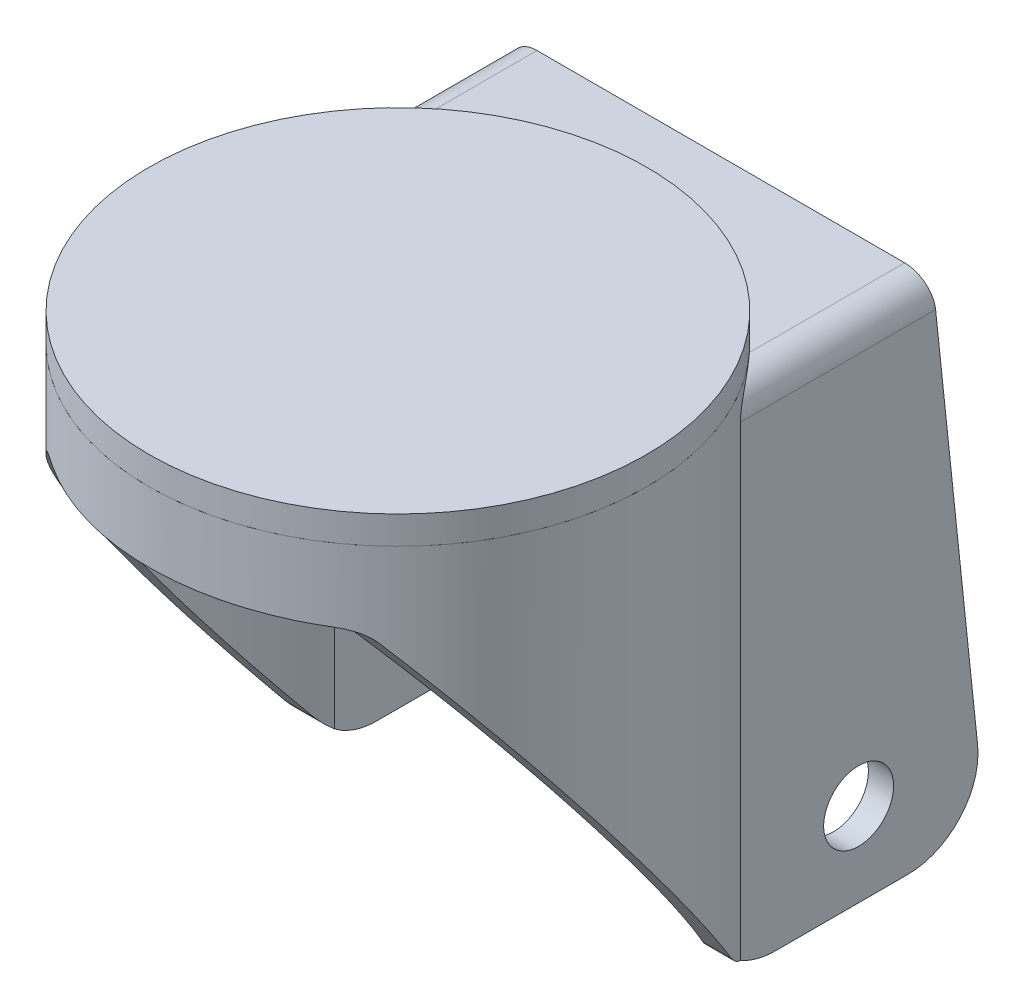
ISO-10303-21;
HEADER;
FILE_DESCRIPTION(('STEP AP214'),'2;1');
FILE_NAME('part.step','',(''),(''),'','','');
FILE_SCHEMA(('AUTOMOTIVE_DESIGN { 1 0 10303 214 1 1 1 1 }'));
ENDSEC;
DATA;
#1=APPLICATION_CONTEXT('core data for automotive mechanical design processes');
#2=APPLICATION_PROTOCOL_DEFINITION('international standard','automotive_design',2000,#1);
#3=PRODUCT_CONTEXT('',#1,'mechanical');
#4=PRODUCT('Part','Part','',(#3));
#5=PRODUCT_RELATED_PRODUCT_CATEGORY('part','',(#4));
#6=PRODUCT_DEFINITION_FORMATION('','',#4);
#7=PRODUCT_DEFINITION_CONTEXT('part definition',#1,'design');
#8=PRODUCT_DEFINITION('design','',#6,#7);
#9=PRODUCT_DEFINITION_SHAPE('','',#8);
#10=(LENGTH_UNIT() NAMED_UNIT(*) SI_UNIT(.MILLI.,.METRE.));
#11=(NAMED_UNIT(*) PLANE_ANGLE_UNIT() SI_UNIT($,.RADIAN.));
#12=(NAMED_UNIT(*) SI_UNIT($,.STERADIAN.) SOLID_ANGLE_UNIT());
#13=UNCERTAINTY_MEASURE_WITH_UNIT(LENGTH_MEASURE(1.E-05),#10,'distance_accuracy_value','');
#14=(GEOMETRIC_REPRESENTATION_CONTEXT(3) GLOBAL_UNCERTAINTY_ASSIGNED_CONTEXT((#13)) GLOBAL_UNIT_ASSIGNED_CONTEXT((#10,
#11,#12)) REPRESENTATION_CONTEXT('',''));
#15=CARTESIAN_POINT('',(0.,0.,0.));
#16=DIRECTION('',(0.,0.,1.));
#17=DIRECTION('',(1.,0.,0.));
#18=AXIS2_PLACEMENT_3D('',#15,#16,#17);
#19=CARTESIAN_POINT('',(0.,-38.,0.));
#20=DIRECTION('',(0.,-1.,0.));
#21=DIRECTION('',(0.,0.,-1.));
#22=AXIS2_PLACEMENT_3D('',#19,#20,#21);
#23=PLANE('',#22);
#24=DIRECTION('',(0.,0.,-1.));
#25=VECTOR('',#24,1.);
#26=CARTESIAN_POINT('',(15.15,-38.,0.));
#27=LINE('',#26,#25);
#28=CARTESIAN_POINT('',(15.15,-38.,-11.8372913800066));
#29=VERTEX_POINT('',#28);
#30=CARTESIAN_POINT('',(15.15,-38.,-21.3444444444444));
#31=VERTEX_POINT('',#30);
#32=EDGE_CURVE('E406',#29,#31,#27,.T.);
#33=ORIENTED_EDGE('',*,*,#32,.F.);
#34=DIRECTION('',(1.,0.,0.));
#35=VECTOR('',#34,1.);
#36=CARTESIAN_POINT('',(13.35,-38.,-11.8372913800066));
#37=LINE('',#36,#35);
#38=CARTESIAN_POINT('',(13.35,-38.,-11.8372913800066));
#39=VERTEX_POINT('',#38);
#40=EDGE_CURVE('E465',#29,#39,#37,.F.);
#41=ORIENTED_EDGE('',*,*,#40,.T.);
#42=DIRECTION('',(0.,0.,1.));
#43=VECTOR('',#42,1.);
#44=CARTESIAN_POINT('',(13.35,-38.,0.));
#45=LINE('',#44,#43);
#46=CARTESIAN_POINT('',(13.35,-38.,-21.3444444444444));
#47=VERTEX_POINT('',#46);
#48=EDGE_CURVE('E390',#47,#39,#45,.T.);
#49=ORIENTED_EDGE('',*,*,#48,.F.);
#50=DIRECTION('',(1.,0.,0.));
#51=VECTOR('',#50,1.);
#52=CARTESIAN_POINT('',(0.,-38.,-21.3444444444444));
#53=LINE('',#52,#51);
#54=EDGE_CURVE('E448',#47,#31,#53,.T.);
#55=ORIENTED_EDGE('',*,*,#54,.T.);
#56=EDGE_LOOP('',(#33,#41,#49,#55));
#57=FACE_BOUND('',#56,.T.);
#58=ADVANCED_FACE('F48',(#57),#23,.T.);
#59=CARTESIAN_POINT('',(0.,-38.,0.));
#60=DIRECTION('',(0.,1.,0.));
#61=DIRECTION('',(0.,0.,1.));
#62=AXIS2_PLACEMENT_3D('',#59,#60,#61);
#63=CYLINDRICAL_SURFACE('',#62,17.8);
#64=CARTESIAN_POINT('',(0.,-25.5995844777628,0.));
#65=DIRECTION('',(0.,0.60181502315205,-0.798635510047292));
#66=DIRECTION('',(0.,0.798635510047292,0.60181502315205));
#67=AXIS2_PLACEMENT_3D('',#64,#65,#66);
#68=ELLIPSE('',#67,29.5771945119801,17.8);
#69=CARTESIAN_POINT('',(11.8749417911061,-8.0030623430172,13.259930522361));
#70=VERTEX_POINT('',#69);
#71=CARTESIAN_POINT('',(15.9784191403783,-36.0090751157602,-7.84411382977014));
#72=VERTEX_POINT('',#71);
#73=EDGE_CURVE('E380',#70,#72,#68,.T.);
#74=ORIENTED_EDGE('',*,*,#73,.T.);
#75=CARTESIAN_POINT('',(15.9784191403783,-36.0090751157602,-7.84411382977015));
#76=CARTESIAN_POINT('',(15.9370643285474,-36.1209263768621,-7.92836646893781));
#77=CARTESIAN_POINT('',(15.8928061221344,-36.2284980160103,-8.01682426117746));
#78=CARTESIAN_POINT('',(15.7985679836179,-36.4345557424555,-8.20096866466969));
#79=CARTESIAN_POINT('',(15.7485884831887,-36.5330425141989,-8.2966547303605));
#80=CARTESIAN_POINT('',(15.6438829485341,-36.7188306796397,-8.49241137076984));
#81=CARTESIAN_POINT('',(15.5892518997026,-36.8062935799278,-8.59237993299204));
#82=CARTESIAN_POINT('',(15.4747009718694,-36.9716452851065,-8.79700855586593));
#83=CARTESIAN_POINT('',(15.4147835689916,-37.0495385319381,-8.90166640887018));
#84=CARTESIAN_POINT('',(15.3200249880923,-37.160369308893,-9.06316256439766));
#85=CARTESIAN_POINT('',(15.2870439362268,-37.1968544701722,-9.11869213710637));
#86=CARTESIAN_POINT('',(15.2195987988801,-37.2674037675836,-9.23082418364883));
#87=CARTESIAN_POINT('',(15.1851287234307,-37.3014563069182,-9.28743035341463));
#88=CARTESIAN_POINT('',(15.15,-37.3342138275323,-9.3443833397394));
#89=B_SPLINE_CURVE_WITH_KNOTS('',3,(#75,#76,#77,#78,#79,#80,#81,#82,#83,#84,#85,#86,#87,#88),
.UNSPECIFIED.,.F.,.F.,(4,2,2,2,2,2,4),(0.,0.437844269784068,0.8756555257534,1.30603416387316,
1.73621227249518,1.95869474531471,2.1821754237998),.UNSPECIFIED.);
#90=CARTESIAN_POINT('',(15.15,-37.3342138275322,-9.34438333973945));
#91=VERTEX_POINT('',#90);
#92=EDGE_CURVE('E328',#72,#91,#89,.T.);
#93=ORIENTED_EDGE('',*,*,#92,.T.);
#94=DIRECTION('',(0.,1.,0.));
#95=VECTOR('',#94,1.);
#96=CARTESIAN_POINT('',(15.15,-38.,-9.34438333973945));
#97=LINE('',#96,#95);
#98=CARTESIAN_POINT('',(15.15,-4.,-9.34438333973945));
#99=VERTEX_POINT('',#98);
#100=EDGE_CURVE('E367',#91,#99,#97,.T.);
#101=ORIENTED_EDGE('',*,*,#100,.T.);
#102=CARTESIAN_POINT('',(15.15,-4.,-9.34438333973945));
#103=CARTESIAN_POINT('',(15.1500044913851,-3.96802003997275,-9.34437491508055));
#104=CARTESIAN_POINT('',(15.1492324599647,-3.93605743037064,-9.34562783917578));
#105=CARTESIAN_POINT('',(15.1461802338515,-3.87242908389206,-9.35057417411396));
#106=CARTESIAN_POINT('',(15.1439017241506,-3.84076305537626,-9.35426485832448));
#107=CARTESIAN_POINT('',(15.1349412718755,-3.74722846589952,-9.36876114165658));
#108=CARTESIAN_POINT('',(15.1261320623997,-3.68606724013996,-9.38299518048252));
#109=CARTESIAN_POINT('',(15.1006925489816,-3.55216723035157,-9.42389442857311));
#110=CARTESIAN_POINT('',(15.0826502531463,-3.48039771070193,-9.45278914575787));
#111=CARTESIAN_POINT('',(15.040402650042,-3.3430536286514,-9.51986706916303));
#112=CARTESIAN_POINT('',(15.0161681189278,-3.27751052122967,-9.55809428027507));
#113=CARTESIAN_POINT('',(14.9479004189922,-3.11746567064031,-9.66468734081145));
#114=CARTESIAN_POINT('',(14.9004400209228,-3.0276597636102,-9.73783934105056));
#115=CARTESIAN_POINT('',(14.7975369191279,-2.8619486173237,-9.89351736127712));
#116=CARTESIAN_POINT('',(14.7420766683606,-2.78607479097534,-9.97606390119344));
#117=CARTESIAN_POINT('',(14.6339177774277,-2.65688528124339,-10.1339133284594));
#118=CARTESIAN_POINT('',(14.5820567984909,-2.60189310337748,-10.2084403555514));
#119=CARTESIAN_POINT('',(14.4746351279346,-2.49971947682505,-10.3601924212146));
#120=CARTESIAN_POINT('',(14.4190720225719,-2.45254319528551,-10.4374192040889));
#121=CARTESIAN_POINT('',(14.304661627593,-2.36539533523306,-10.593679797889));
#122=CARTESIAN_POINT('',(14.2458094564935,-2.32543485908339,-10.6727161861033));
#123=CARTESIAN_POINT('',(14.1252286700477,-2.2524603675749,-10.8317995169759));
#124=CARTESIAN_POINT('',(14.0634996867082,-2.21944724389596,-10.9118465879576));
#125=CARTESIAN_POINT('',(13.9342840563258,-2.15873794697491,-11.0764260003547));
#126=CARTESIAN_POINT('',(13.8666638803877,-2.13139080756228,-11.1609822203631));
#127=CARTESIAN_POINT('',(13.7288417232189,-2.08421158723687,-11.3300842390604));
#128=CARTESIAN_POINT('',(13.6586397478337,-2.06437948931025,-11.4146300377725));
#129=CARTESIAN_POINT('',(13.5164506217465,-2.03251699641871,-11.5826407637699));
#130=CARTESIAN_POINT('',(13.4444798933678,-2.02043164614877,-11.6661090938537));
#131=CARTESIAN_POINT('',(13.2986040828682,-2.00418452418078,-11.8321346587693));
#132=CARTESIAN_POINT('',(13.2246987644367,-2.00002372508953,-11.9146917805294));
#133=CARTESIAN_POINT('',(13.15,-2.,-11.9965620075087));
#134=B_SPLINE_CURVE_WITH_KNOTS('',3,(#102,#103,#104,#105,#106,#107,#108,#109,#110,#111,#112,
#113,#114,#115,#116,#117,#118,#119,#120,#121,#122,#123,#124,#125,#126,#127,#128,#129,#130,#131,
#132,#133),.UNSPECIFIED.,.F.,.F.,(4,2,2,2,2,2,2,2,2,2,2,2,2,2,2,4),(0.,0.0958741558557508,
0.191641257734945,0.380939748981565,0.617969246113741,0.856138743865303,1.22958098722207,
1.60385516654574,1.92187918600012,2.24011262168833,2.55883160053854,2.87759146146665,
3.21231347908181,3.5470347388922,3.87935441573922,4.21171487666901),.UNSPECIFIED.);
#135=CARTESIAN_POINT('',(13.15,-2.,-11.9965620075087));
#136=VERTEX_POINT('',#135);
#137=EDGE_CURVE('E302',#99,#136,#134,.T.);
#138=ORIENTED_EDGE('',*,*,#137,.T.);
#139=CARTESIAN_POINT('',(0.,-2.,0.));
#140=DIRECTION('',(0.,-1.,0.));
#141=DIRECTION('',(0.,0.,-1.));
#142=AXIS2_PLACEMENT_3D('',#139,#140,#141);
#143=CIRCLE('',#142,17.8);
#144=CARTESIAN_POINT('',(-13.15,-2.,-11.9965620075086));
#145=VERTEX_POINT('',#144);
#146=EDGE_CURVE('E403',#136,#145,#143,.T.);
#147=ORIENTED_EDGE('',*,*,#146,.T.);
#148=CARTESIAN_POINT('',(-13.15,-2.,-11.9965620075086));
#149=CARTESIAN_POINT('',(-13.2356506560254,-2.00004136373039,-11.9026943935347));
#150=CARTESIAN_POINT('',(-13.3202496499454,-2.00550123528703,-11.8079250256664));
#151=CARTESIAN_POINT('',(-13.4868647387511,-2.0267746044045,-11.6172455843618));
#152=CARTESIAN_POINT('',(-13.5688803578408,-2.04258999765425,-11.5213353052262));
#153=CARTESIAN_POINT('',(-13.7306540826701,-2.08430640658682,-11.3280721654483));
#154=CARTESIAN_POINT('',(-13.810379848435,-2.11031058005942,-11.2307146743641));
#155=CARTESIAN_POINT('',(-13.9662383454885,-2.17221733253376,-11.0362896531584));
#156=CARTESIAN_POINT('',(-14.0423718746912,-2.20811770113709,-10.9392220631734));
#157=CARTESIAN_POINT('',(-14.1726424830384,-2.28002491253495,-10.7696200534765));
#158=CARTESIAN_POINT('',(-14.2276411136122,-2.31390010144695,-10.6968376635466));
#159=CARTESIAN_POINT('',(-14.3350825949469,-2.38760305613472,-10.5524167787142));
#160=CARTESIAN_POINT('',(-14.3875259698068,-2.42742959437816,-10.4807780512832));
#161=CARTESIAN_POINT('',(-14.4893825788626,-2.51323348812185,-10.3395041941785));
#162=CARTESIAN_POINT('',(-14.5388059013647,-2.55918852512781,-10.2698628589337));
#163=CARTESIAN_POINT('',(-14.6343748995659,-2.6578576318701,-10.1332134279908));
#164=CARTESIAN_POINT('',(-14.6805226149185,-2.71056743714993,-10.0662037054637));
#165=CARTESIAN_POINT('',(-14.7715719495261,-2.82684879134706,-9.93214988916664));
#166=CARTESIAN_POINT('',(-14.8162380858708,-2.89087861481377,-9.8653385854325));
#167=CARTESIAN_POINT('',(-14.9000798064216,-3.02855125683244,-9.73824401891077));
#168=CARTESIAN_POINT('',(-14.9392555342591,-3.10219382381386,-9.67796058536089));
#169=CARTESIAN_POINT('',(-15.0024744592622,-3.24306991027794,-9.57958331259898));
#170=CARTESIAN_POINT('',(-15.0279586022108,-3.3082533633,-9.53950888561072));
#171=CARTESIAN_POINT('',(-15.072830486558,-3.44515019249458,-9.46844987458594));
#172=CARTESIAN_POINT('',(-15.0922468568252,-3.51683078031419,-9.43742265209575));
#173=CARTESIAN_POINT('',(-15.1145316627108,-3.62356050282801,-9.40165390951594));
#174=CARTESIAN_POINT('',(-15.1205421907569,-3.65634791659291,-9.39198076419859));
#175=CARTESIAN_POINT('',(-15.1309831151931,-3.72280769233285,-9.37515052084795));
#176=CARTESIAN_POINT('',(-15.1354141053874,-3.75647971662924,-9.36799247731344));
#177=CARTESIAN_POINT('',(-15.1426221600849,-3.82491832411272,-9.35633715012549));
#178=CARTESIAN_POINT('',(-15.1453768286638,-3.85969346384708,-9.35187590108708));
#179=CARTESIAN_POINT('',(-15.1490718471655,-3.92964137700171,-9.34588812133353));
#180=CARTESIAN_POINT('',(-15.1500094950807,-3.96481466449061,-9.34436596121375));
#181=CARTESIAN_POINT('',(-15.15,-4.,-9.34438333973943));
#182=B_SPLINE_CURVE_WITH_KNOTS('',3,(#148,#149,#150,#151,#152,#153,#154,#155,#156,#157,#158,
#159,#160,#161,#162,#163,#164,#165,#166,#167,#168,#169,#170,#171,#172,#173,#174,#175,#176,#177,
#178,#179,#180,#181),.UNSPECIFIED.,.F.,.F.,(4,2,2,2,2,2,2,2,2,2,2,2,2,2,2,2,4),(0.,
0.381032275278548,0.762134322095559,1.14719896732843,1.53217767472648,1.82391629824563,
2.11559483025976,2.40623875678213,2.69670008814059,3.00435598974504,3.31200384144677,
3.55321728178369,3.793274822718,3.8972883963899,4.00126282633854,4.10659750584857,
4.21208870385356),.UNSPECIFIED.);
#183=CARTESIAN_POINT('',(-15.15,-4.,-9.34438333973943));
#184=VERTEX_POINT('',#183);
#185=EDGE_CURVE('E296',#145,#184,#182,.T.);
#186=ORIENTED_EDGE('',*,*,#185,.T.);
#187=DIRECTION('',(0.,1.,0.));
#188=VECTOR('',#187,1.);
#189=CARTESIAN_POINT('',(-15.15,-38.,-9.34438333973943));
#190=LINE('',#189,#188);
#191=CARTESIAN_POINT('',(-15.15,-37.3342138275322,-9.34438333973943));
#192=VERTEX_POINT('',#191);
#193=EDGE_CURVE('E364',#192,#184,#190,.T.);
#194=ORIENTED_EDGE('',*,*,#193,.F.);
#195=CARTESIAN_POINT('',(-15.15,-37.3342138275322,-9.34438333973943));
#196=CARTESIAN_POINT('',(-15.2188241028936,-37.2700720037347,-9.23282435699249));
#197=CARTESIAN_POINT('',(-15.2851215388517,-37.2008933254542,-9.12255380855348));
#198=CARTESIAN_POINT('',(-15.4125135220679,-37.052476473274,-8.90562417649032));
#199=CARTESIAN_POINT('',(-15.4736020980385,-36.9732270068474,-8.79896931994012));
#200=CARTESIAN_POINT('',(-15.5892122201401,-36.8063552534815,-8.59245298937837));
#201=CARTESIAN_POINT('',(-15.6438327654645,-36.7189108628204,-8.4925033959789));
#202=CARTESIAN_POINT('',(-15.7475851525126,-36.5348316486884,-8.2985323414789));
#203=CARTESIAN_POINT('',(-15.7967216805386,-36.4382048047706,-8.20450584926292));
#204=CARTESIAN_POINT('',(-15.8670743133884,-36.2849476814025,-8.06713881964642));
#205=CARTESIAN_POINT('',(-15.8903223497382,-36.2315154356483,-8.02123304848153));
#206=CARTESIAN_POINT('',(-15.9354407808521,-36.1221239694439,-7.93122134988455));
#207=CARTESIAN_POINT('',(-15.9573041181888,-36.0661539652079,-7.88712499220734));
#208=CARTESIAN_POINT('',(-15.9784191403783,-36.0090751157602,-7.84411382977014));
#209=B_SPLINE_CURVE_WITH_KNOTS('',3,(#195,#196,#197,#198,#199,#200,#201,#202,#203,#204,#205,
#206,#207,#208),.UNSPECIFIED.,.F.,.F.,(4,2,2,2,2,2,4),(0.,0.437742831757058,0.875980915444915,
1.30627187277768,1.73619226824224,1.95866765319446,2.18219827846771),.UNSPECIFIED.);
#210=CARTESIAN_POINT('',(-15.9784191403783,-36.0090751157603,-7.84411382977015));
#211=VERTEX_POINT('',#210);
#212=EDGE_CURVE('E436',#192,#211,#209,.T.);
#213=ORIENTED_EDGE('',*,*,#212,.T.);
#214=CARTESIAN_POINT('',(-11.8749417911061,-8.0030623430172,13.259930522361));
#215=VERTEX_POINT('',#214);
#216=EDGE_CURVE('E357',#211,#215,#68,.T.);
#217=ORIENTED_EDGE('',*,*,#216,.T.);
#218=CARTESIAN_POINT('',(-11.8749417911061,-8.0030623430172,13.259930522361));
#219=CARTESIAN_POINT('',(-11.826542849212,-7.94556866565135,13.3032825241894));
#220=CARTESIAN_POINT('',(-11.7754957130021,-7.89196589276396,13.3485113519015));
#221=CARTESIAN_POINT('',(-11.6690969374721,-7.79220141576577,13.4416188409065));
#222=CARTESIAN_POINT('',(-11.6137574331526,-7.74601979195196,13.4894899290087));
#223=CARTESIAN_POINT('',(-11.4451051606997,-7.61971840340374,13.6334497889522));
#224=CARTESIAN_POINT('',(-11.3267536204723,-7.54914111234851,13.7320584275628));
#225=CARTESIAN_POINT('',(-11.1133170571538,-7.44585287637273,13.9049608943218));
#226=CARTESIAN_POINT('',(-11.0202334201882,-7.40806630560256,13.9788753014374));
#227=CARTESIAN_POINT('',(-10.8301967309528,-7.34315977255349,14.1266170830843));
#228=CARTESIAN_POINT('',(-10.7332401250741,-7.31604986622673,14.2004443105795));
#229=CARTESIAN_POINT('',(-10.5328103333437,-7.27049689657772,14.3497766700024));
#230=CARTESIAN_POINT('',(-10.4292288202683,-7.25241246384986,14.4252425152036));
#231=CARTESIAN_POINT('',(-10.2199504260189,-7.22537532776549,14.5742643075796));
#232=CARTESIAN_POINT('',(-10.1142601820915,-7.21639752570123,14.6478249566422));
#233=CARTESIAN_POINT('',(-10.0077113091543,-7.21138693657741,14.7202484473811));
#234=B_SPLINE_CURVE_WITH_KNOTS('',3,(#218,#219,#220,#221,#222,#223,#224,#225,#226,#227,#228,
#229,#230,#231,#232,#233),.UNSPECIFIED.,.F.,.F.,(4,2,2,2,2,2,2,4),(0.,0.259879797216476,
0.519049937852626,1.02493561966713,1.39863131072649,1.77267813485307,2.16059426244121,
2.54743832869596),.UNSPECIFIED.);
#235=CARTESIAN_POINT('',(-10.0077113091543,-7.21138693657741,14.7202484473811));
#236=VERTEX_POINT('',#235);
#237=EDGE_CURVE('E257',#215,#236,#234,.T.);
#238=ORIENTED_EDGE('',*,*,#237,.T.);
#239=CARTESIAN_POINT('',(0.,-8.22175032848939,0.));
#240=DIRECTION('',(0.,0.997652726371946,-0.0684765475372615));
#241=DIRECTION('',(0.,0.0684765475372615,0.997652726371946));
#242=AXIS2_PLACEMENT_3D('',#239,#240,#241);
#243=ELLIPSE('',#242,17.8418797738681,17.8);
#244=CARTESIAN_POINT('',(10.0077113091543,-7.21138693657741,14.7202484473811));
#245=VERTEX_POINT('',#244);
#246=EDGE_CURVE('E386',#236,#245,#243,.T.);
#247=ORIENTED_EDGE('',*,*,#246,.T.);
#248=CARTESIAN_POINT('',(10.0077113091543,-7.21138693657741,14.7202484473811));
#249=CARTESIAN_POINT('',(10.0675008250025,-7.21418003952059,14.6796004115241));
#250=CARTESIAN_POINT('',(10.1269980197577,-7.21823770215186,14.6386172698905));
#251=CARTESIAN_POINT('',(10.2453428797962,-7.22905842603673,14.5560350875712));
#252=CARTESIAN_POINT('',(10.30419032586,-7.23582237333258,14.514435849474));
#253=CARTESIAN_POINT('',(10.4801428382628,-7.26051020083538,14.3884486611115));
#254=CARTESIAN_POINT('',(10.5961033670241,-7.28280758913676,14.3032485060699));
#255=CARTESIAN_POINT('',(10.8190368688286,-7.33950293781471,14.1353134284669));
#256=CARTESIAN_POINT('',(10.9261826970999,-7.37335210149801,14.0526256761777));
#257=CARTESIAN_POINT('',(11.1350774672539,-7.45498233727752,13.8876821262194));
#258=CARTESIAN_POINT('',(11.2368372563807,-7.50273404207825,13.8054257863338));
#259=CARTESIAN_POINT('',(11.4332532611742,-7.61425146151298,13.6431988794248));
#260=CARTESIAN_POINT('',(11.5279161587038,-7.67800186076023,13.5632262073557));
#261=CARTESIAN_POINT('',(11.663375544556,-7.78790518421146,13.4465367170488));
#262=CARTESIAN_POINT('',(11.7078639462114,-7.82740433808535,13.4078025558529));
#263=CARTESIAN_POINT('',(11.7938190324404,-7.91141635716678,13.33225909802));
#264=CARTESIAN_POINT('',(11.835280375306,-7.9559377486762,13.2954532350003));
#265=CARTESIAN_POINT('',(11.8749417911061,-8.00306234301719,13.259930522361));
#266=B_SPLINE_CURVE_WITH_KNOTS('',3,(#248,#249,#250,#251,#252,#253,#254,#255,#256,#257,#258,
#259,#260,#261,#262,#263,#264,#265),.UNSPECIFIED.,.F.,.F.,(4,2,2,2,2,2,2,2,4),(0.,
0.217031657200052,0.434134429159768,0.870347750065616,1.28820140552772,1.70517872582957,
2.12175839056864,2.33449218093881,2.54759272706676),.UNSPECIFIED.);
#267=EDGE_CURVE('E286',#245,#70,#266,.T.);
#268=ORIENTED_EDGE('',*,*,#267,.T.);
#269=EDGE_LOOP('',(#74,#93,#101,#138,#147,#186,#194,#213,#217,#238,#247,#268));
#270=FACE_BOUND('',#269,.T.);
#271=ADVANCED_FACE('F274',(#270),#63,.T.);
#272=CARTESIAN_POINT('',(-15.15,-38.,0.));
#273=DIRECTION('',(1.,0.,0.));
#274=DIRECTION('',(0.,0.,-1.));
#275=AXIS2_PLACEMENT_3D('',#272,#273,#274);
#276=PLANE('',#275);
#277=CARTESIAN_POINT('',(-15.15,-32.,-17.8055250032031));
#278=DIRECTION('',(1.,0.,0.));
#279=DIRECTION('',(0.,0.,-1.));
#280=AXIS2_PLACEMENT_3D('',#277,#278,#279);
#281=CIRCLE('',#280,2.5);
#282=CARTESIAN_POINT('',(-15.15,-32.,-20.3055250032031));
#283=VERTEX_POINT('',#282);
#284=EDGE_CURVE('E223',#283,#283,#281,.F.);
#285=ORIENTED_EDGE('',*,*,#284,.F.);
#286=EDGE_LOOP('',(#285));
#287=FACE_BOUND('',#286,.T.);
#288=DIRECTION('',(0.,0.,-1.));
#289=VECTOR('',#288,1.);
#290=CARTESIAN_POINT('',(-15.15,-38.,0.));
#291=LINE('',#290,#289);
#292=CARTESIAN_POINT('',(-15.15,-38.,-11.8372913800066));
#293=VERTEX_POINT('',#292);
#294=CARTESIAN_POINT('',(-15.15,-38.,-21.3444444444444));
#295=VERTEX_POINT('',#294);
#296=EDGE_CURVE('E404',#293,#295,#291,.T.);
#297=ORIENTED_EDGE('',*,*,#296,.F.);
#298=CARTESIAN_POINT('',(-15.15,-33.,-11.8372913800066));
#299=DIRECTION('',(1.,0.,0.));
#300=DIRECTION('',(0.,0.,-1.));
#301=AXIS2_PLACEMENT_3D('',#298,#299,#300);
#302=CIRCLE('',#301,5.);
#303=EDGE_CURVE('E13',#293,#192,#302,.F.);
#304=ORIENTED_EDGE('',*,*,#303,.T.);
#305=ORIENTED_EDGE('',*,*,#193,.T.);
#306=DIRECTION('',(0.,0.,-1.));
#307=VECTOR('',#306,1.);
#308=CARTESIAN_POINT('',(-15.15,-4.,0.));
#309=LINE('',#308,#307);
#310=CARTESIAN_POINT('',(-15.15,-4.,-23.3111111111111));
#311=VERTEX_POINT('',#310);
#312=EDGE_CURVE('E233',#184,#311,#309,.T.);
#313=ORIENTED_EDGE('',*,*,#312,.T.);
#314=DIRECTION('',(0.,-0.994475138121547,-0.104972375690607));
#315=VECTOR('',#314,1.);
#316=CARTESIAN_POINT('',(-15.15,-2.,-23.1));
#317=LINE('',#316,#315);
#318=CARTESIAN_POINT('',(-15.15,-32.475138121547,-26.3168201350522));
#319=VERTEX_POINT('',#318);
#320=EDGE_CURVE('E426',#311,#319,#317,.T.);
#321=ORIENTED_EDGE('',*,*,#320,.T.);
#322=CARTESIAN_POINT('',(-15.15,-33.,-21.3444444444444));
#323=DIRECTION('',(1.,0.,0.));
#324=DIRECTION('',(0.,0.,-1.));
#325=AXIS2_PLACEMENT_3D('',#322,#323,#324);
#326=CIRCLE('',#325,5.);
#327=EDGE_CURVE('E451',#319,#295,#326,.F.);
#328=ORIENTED_EDGE('',*,*,#327,.T.);
#329=EDGE_LOOP('',(#297,#304,#305,#313,#321,#328));
#330=FACE_BOUND('',#329,.T.);
#331=ADVANCED_FACE('F431',(#287,#330),#276,.F.);
#332=CARTESIAN_POINT('',(15.15,-38.,0.));
#333=DIRECTION('',(1.,0.,0.));
#334=DIRECTION('',(0.,0.,-1.));
#335=AXIS2_PLACEMENT_3D('',#332,#333,#334);
#336=PLANE('',#335);
#337=CARTESIAN_POINT('',(15.15,-32.,-17.805525003203));
#338=DIRECTION('',(1.,0.,0.));
#339=DIRECTION('',(0.,0.,-1.));
#340=AXIS2_PLACEMENT_3D('',#337,#338,#339);
#341=CIRCLE('',#340,2.5);
#342=CARTESIAN_POINT('',(15.15,-32.,-20.305525003203));
#343=VERTEX_POINT('',#342);
#344=EDGE_CURVE('E478',#343,#343,#341,.T.);
#345=ORIENTED_EDGE('',*,*,#344,.F.);
#346=EDGE_LOOP('',(#345));
#347=FACE_BOUND('',#346,.T.);
#348=ORIENTED_EDGE('',*,*,#100,.F.);
#349=CARTESIAN_POINT('',(15.15,-33.,-11.8372913800066));
#350=DIRECTION('',(1.,0.,0.));
#351=DIRECTION('',(0.,0.,-1.));
#352=AXIS2_PLACEMENT_3D('',#349,#350,#351);
#353=CIRCLE('',#352,5.);
#354=EDGE_CURVE('E438',#91,#29,#353,.T.);
#355=ORIENTED_EDGE('',*,*,#354,.T.);
#356=ORIENTED_EDGE('',*,*,#32,.T.);
#357=CARTESIAN_POINT('',(15.15,-33.,-21.3444444444444));
#358=DIRECTION('',(1.,0.,0.));
#359=DIRECTION('',(0.,0.,-1.));
#360=AXIS2_PLACEMENT_3D('',#357,#358,#359);
#361=CIRCLE('',#360,5.);
#362=CARTESIAN_POINT('',(15.15,-32.475138121547,-26.3168201350522));
#363=VERTEX_POINT('',#362);
#364=EDGE_CURVE('E446',#31,#363,#361,.T.);
#365=ORIENTED_EDGE('',*,*,#364,.T.);
#366=DIRECTION('',(0.,0.994475138121547,0.104972375690607));
#367=VECTOR('',#366,1.);
#368=CARTESIAN_POINT('',(15.15,-2.,-23.1));
#369=LINE('',#368,#367);
#370=CARTESIAN_POINT('',(15.15,-4.,-23.3111111111111));
#371=VERTEX_POINT('',#370);
#372=EDGE_CURVE('E419',#363,#371,#369,.T.);
#373=ORIENTED_EDGE('',*,*,#372,.T.);
#374=DIRECTION('',(0.,0.,-1.));
#375=VECTOR('',#374,1.);
#376=CARTESIAN_POINT('',(15.15,-4.,-9.34438333973945));
#377=LINE('',#376,#375);
#378=EDGE_CURVE('E247',#371,#99,#377,.F.);
#379=ORIENTED_EDGE('',*,*,#378,.T.);
#380=EDGE_LOOP('',(#348,#355,#356,#365,#373,#379));
#381=FACE_BOUND('',#380,.T.);
#382=ADVANCED_FACE('F418',(#347,#381),#336,.T.);
#383=DIRECTION('',(0.,0.,-1.));
#384=VECTOR('',#383,1.);
#385=CARTESIAN_POINT('',(-13.35,-38.,0.));
#386=LINE('',#385,#384);
#387=CARTESIAN_POINT('',(-13.35,-38.,-11.8372913800066));
#388=VERTEX_POINT('',#387);
#389=CARTESIAN_POINT('',(-13.35,-38.,-21.3444444444444));
#390=VERTEX_POINT('',#389);
#391=EDGE_CURVE('E392',#388,#390,#386,.T.);
#392=ORIENTED_EDGE('',*,*,#391,.F.);
#393=DIRECTION('',(1.,0.,0.));
#394=VECTOR('',#393,1.);
#395=CARTESIAN_POINT('',(-15.15,-38.,-11.8372913800066));
#396=LINE('',#395,#394);
#397=EDGE_CURVE('E57',#388,#293,#396,.F.);
#398=ORIENTED_EDGE('',*,*,#397,.T.);
#399=ORIENTED_EDGE('',*,*,#296,.T.);
#400=DIRECTION('',(1.,0.,0.));
#401=VECTOR('',#400,1.);
#402=CARTESIAN_POINT('',(0.,-38.,-21.3444444444444));
#403=LINE('',#402,#401);
#404=EDGE_CURVE('E308',#295,#390,#403,.T.);
#405=ORIENTED_EDGE('',*,*,#404,.T.);
#406=EDGE_LOOP('',(#392,#398,#399,#405));
#407=FACE_BOUND('',#406,.T.);
#408=ADVANCED_FACE('F459',(#407),#23,.T.);
#409=CARTESIAN_POINT('',(0.,-2.,0.));
#410=DIRECTION('',(0.,-1.,0.));
#411=DIRECTION('',(0.,0.,-1.));
#412=AXIS2_PLACEMENT_3D('',#409,#410,#411);
#413=PLANE('',#412);
#414=DIRECTION('',(1.,0.,0.));
#415=VECTOR('',#414,1.);
#416=CARTESIAN_POINT('',(0.,-2.,-23.1));
#417=LINE('',#416,#415);
#418=CARTESIAN_POINT('',(-13.15,-2.,-23.1));
#419=VERTEX_POINT('',#418);
#420=CARTESIAN_POINT('',(13.15,-2.,-23.1));
#421=VERTEX_POINT('',#420);
#422=EDGE_CURVE('E407',#419,#421,#417,.T.);
#423=ORIENTED_EDGE('',*,*,#422,.F.);
#424=DIRECTION('',(0.,0.,-1.));
#425=VECTOR('',#424,1.);
#426=CARTESIAN_POINT('',(-13.15,-2.,0.));
#427=LINE('',#426,#425);
#428=EDGE_CURVE('E244',#419,#145,#427,.F.);
#429=ORIENTED_EDGE('',*,*,#428,.T.);
#430=ORIENTED_EDGE('',*,*,#146,.F.);
#431=DIRECTION('',(0.,0.,-1.));
#432=VECTOR('',#431,1.);
#433=CARTESIAN_POINT('',(13.15,-2.,-23.1));
#434=LINE('',#433,#432);
#435=EDGE_CURVE('E241',#136,#421,#434,.T.);
#436=ORIENTED_EDGE('',*,*,#435,.T.);
#437=EDGE_LOOP('',(#423,#429,#430,#436));
#438=FACE_BOUND('',#437,.T.);
#439=ADVANCED_FACE('F422',(#438),#413,.F.);
#440=CARTESIAN_POINT('',(13.35,48.5253401769845,0.));
#441=DIRECTION('',(1.,0.,0.));
#442=DIRECTION('',(0.,0.,-1.));
#443=AXIS2_PLACEMENT_3D('',#440,#441,#442);
#444=PLANE('',#443);
#445=CARTESIAN_POINT('',(13.35,-32.,-17.805525003203));
#446=DIRECTION('',(1.,0.,0.));
#447=DIRECTION('',(0.,0.,-1.));
#448=AXIS2_PLACEMENT_3D('',#445,#446,#447);
#449=CIRCLE('',#448,2.5);
#450=CARTESIAN_POINT('',(13.35,-32.,-20.305525003203));
#451=VERTEX_POINT('',#450);
#452=EDGE_CURVE('E222',#451,#451,#449,.T.);
#453=ORIENTED_EDGE('',*,*,#452,.T.);
#454=EDGE_LOOP('',(#453));
#455=FACE_BOUND('',#454,.T.);
#456=ORIENTED_EDGE('',*,*,#48,.T.);
#457=CARTESIAN_POINT('',(13.35,-33.,-11.8372913800066));
#458=DIRECTION('',(1.,0.,0.));
#459=DIRECTION('',(0.,0.,-1.));
#460=AXIS2_PLACEMENT_3D('',#457,#458,#459);
#461=CIRCLE('',#460,5.);
#462=CARTESIAN_POINT('',(13.35,-36.9863334697726,-8.8191552883482));
#463=VERTEX_POINT('',#462);
#464=EDGE_CURVE('E464',#39,#463,#461,.F.);
#465=ORIENTED_EDGE('',*,*,#464,.T.);
#466=DIRECTION('',(0.,-1.,0.));
#467=VECTOR('',#466,1.);
#468=CARTESIAN_POINT('',(13.35,48.5253401769845,-8.8191552883482));
#469=LINE('',#468,#467);
#470=CARTESIAN_POINT('',(13.35,-3.8,-8.8191552883482));
#471=VERTEX_POINT('',#470);
#472=EDGE_CURVE('E194',#471,#463,#469,.T.);
#473=ORIENTED_EDGE('',*,*,#472,.F.);
#474=DIRECTION('',(0.,0.,-1.));
#475=VECTOR('',#474,1.);
#476=CARTESIAN_POINT('',(13.35,-3.8,0.));
#477=LINE('',#476,#475);
#478=CARTESIAN_POINT('',(13.35,-3.8,-23.29));
#479=VERTEX_POINT('',#478);
#480=EDGE_CURVE('E186',#471,#479,#477,.T.);
#481=ORIENTED_EDGE('',*,*,#480,.T.);
#482=DIRECTION('',(0.,-0.994475138121547,-0.104972375690607));
#483=VECTOR('',#482,1.);
#484=CARTESIAN_POINT('',(13.35,-2.,-23.1));
#485=LINE('',#484,#483);
#486=CARTESIAN_POINT('',(13.35,-32.475138121547,-26.3168201350522));
#487=VERTEX_POINT('',#486);
#488=EDGE_CURVE('E191',#479,#487,#485,.T.);
#489=ORIENTED_EDGE('',*,*,#488,.T.);
#490=CARTESIAN_POINT('',(13.35,-33.,-21.3444444444444));
#491=DIRECTION('',(1.,0.,0.));
#492=DIRECTION('',(0.,0.,-1.));
#493=AXIS2_PLACEMENT_3D('',#490,#491,#492);
#494=CIRCLE('',#493,5.);
#495=EDGE_CURVE('E439',#487,#47,#494,.F.);
#496=ORIENTED_EDGE('',*,*,#495,.T.);
#497=EDGE_LOOP('',(#456,#465,#473,#481,#489,#496));
#498=FACE_BOUND('',#497,.T.);
#499=ADVANCED_FACE('F189',(#455,#498),#444,.F.);
#500=CARTESIAN_POINT('',(-13.35,48.5253401769845,0.));
#501=DIRECTION('',(-1.,0.,0.));
#502=DIRECTION('',(0.,0.,1.));
#503=AXIS2_PLACEMENT_3D('',#500,#501,#502);
#504=PLANE('',#503);
#505=CARTESIAN_POINT('',(-13.35,-32.,-17.8055250032031));
#506=DIRECTION('',(-1.,0.,0.));
#507=DIRECTION('',(0.,0.,1.));
#508=AXIS2_PLACEMENT_3D('',#505,#506,#507);
#509=CIRCLE('',#508,2.5);
#510=CARTESIAN_POINT('',(-13.35,-32.,-15.3055250032031));
#511=VERTEX_POINT('',#510);
#512=EDGE_CURVE('E220',#511,#511,#509,.T.);
#513=ORIENTED_EDGE('',*,*,#512,.T.);
#514=EDGE_LOOP('',(#513));
#515=FACE_BOUND('',#514,.T.);
#516=DIRECTION('',(0.,-1.,0.));
#517=VECTOR('',#516,1.);
#518=CARTESIAN_POINT('',(-13.35,48.5253401769845,-8.81915528834819));
#519=LINE('',#518,#517);
#520=CARTESIAN_POINT('',(-13.35,-3.8,-8.81915528834819));
#521=VERTEX_POINT('',#520);
#522=CARTESIAN_POINT('',(-13.35,-36.9863334697726,-8.81915528834819));
#523=VERTEX_POINT('',#522);
#524=EDGE_CURVE('E397',#521,#523,#519,.T.);
#525=ORIENTED_EDGE('',*,*,#524,.T.);
#526=CARTESIAN_POINT('',(-13.35,-33.,-11.8372913800066));
#527=DIRECTION('',(-1.,0.,0.));
#528=DIRECTION('',(0.,0.,1.));
#529=AXIS2_PLACEMENT_3D('',#526,#527,#528);
#530=CIRCLE('',#529,5.);
#531=EDGE_CURVE('E71',#523,#388,#530,.F.);
#532=ORIENTED_EDGE('',*,*,#531,.T.);
#533=ORIENTED_EDGE('',*,*,#391,.T.);
#534=CARTESIAN_POINT('',(-13.35,-33.,-21.3444444444444));
#535=DIRECTION('',(-1.,0.,0.));
#536=DIRECTION('',(0.,0.,1.));
#537=AXIS2_PLACEMENT_3D('',#534,#535,#536);
#538=CIRCLE('',#537,5.);
#539=CARTESIAN_POINT('',(-13.35,-32.475138121547,-26.3168201350522));
#540=VERTEX_POINT('',#539);
#541=EDGE_CURVE('E455',#390,#540,#538,.F.);
#542=ORIENTED_EDGE('',*,*,#541,.T.);
#543=DIRECTION('',(0.,0.994475138121547,0.104972375690607));
#544=VECTOR('',#543,1.);
#545=CARTESIAN_POINT('',(-13.35,-2.,-23.1));
#546=LINE('',#545,#544);
#547=CARTESIAN_POINT('',(-13.35,-3.8,-23.29));
#548=VERTEX_POINT('',#547);
#549=EDGE_CURVE('E206',#540,#548,#546,.T.);
#550=ORIENTED_EDGE('',*,*,#549,.T.);
#551=DIRECTION('',(0.,0.,1.));
#552=VECTOR('',#551,1.);
#553=CARTESIAN_POINT('',(-13.35,-3.8,0.));
#554=LINE('',#553,#552);
#555=EDGE_CURVE('E198',#548,#521,#554,.T.);
#556=ORIENTED_EDGE('',*,*,#555,.T.);
#557=EDGE_LOOP('',(#525,#532,#533,#542,#550,#556));
#558=FACE_BOUND('',#557,.T.);
#559=ADVANCED_FACE('F461',(#515,#558),#504,.F.);
#560=CARTESIAN_POINT('',(0.,48.5253401769845,0.));
#561=DIRECTION('',(0.,-1.,0.));
#562=DIRECTION('',(0.,0.,-1.));
#563=AXIS2_PLACEMENT_3D('',#560,#561,#562);
#564=CYLINDRICAL_SURFACE('',#563,16.);
#565=ORIENTED_EDGE('',*,*,#472,.T.);
#566=CARTESIAN_POINT('',(13.35,-36.9863334697726,-8.8191552883482));
#567=CARTESIAN_POINT('',(13.4087654885758,-36.9190069409058,-8.73021135425566));
#568=CARTESIAN_POINT('',(13.4653549225967,-36.847979338008,-8.64260368754077));
#569=CARTESIAN_POINT('',(13.5737413753745,-36.6990792803002,-8.47134595373996));
#570=CARTESIAN_POINT('',(13.6255633959792,-36.6212472719921,-8.38767651516504));
#571=CARTESIAN_POINT('',(13.7246377468048,-36.4585342276783,-8.22456287187634));
#572=CARTESIAN_POINT('',(13.7718897373212,-36.3736526685281,-8.14511898145779));
#573=CARTESIAN_POINT('',(13.8619918819978,-36.1966501441904,-7.99082187117815));
#574=CARTESIAN_POINT('',(13.904815821251,-36.1044911946573,-7.91599694246608));
#575=CARTESIAN_POINT('',(13.9452457212345,-36.0090751157602,-7.84411382977014));
#576=B_SPLINE_CURVE_WITH_KNOTS('',3,(#566,#567,#568,#569,#570,#571,#572,#573,#574,#575),
.UNSPECIFIED.,.F.,.F.,(4,2,2,2,4),(0.,0.378202130629654,0.754291878816033,1.13040956146025,
1.50863981776518),.UNSPECIFIED.);
#577=CARTESIAN_POINT('',(13.9452457212345,-36.0090751157602,-7.84411382977015));
#578=VERTEX_POINT('',#577);
#579=EDGE_CURVE('E335',#463,#578,#576,.T.);
#580=ORIENTED_EDGE('',*,*,#579,.T.);
#581=CARTESIAN_POINT('',(0.,-25.5995844777628,0.));
#582=DIRECTION('',(0.,0.60181502315205,-0.798635510047292));
#583=DIRECTION('',(0.,-0.798635510047292,-0.60181502315205));
#584=AXIS2_PLACEMENT_3D('',#581,#582,#583);
#585=ELLIPSE('',#584,26.5862422579597,16.);
#586=CARTESIAN_POINT('',(8.95400706623343,-8.00306234301719,13.259930522361));
#587=VERTEX_POINT('',#586);
#588=EDGE_CURVE('E207',#578,#587,#585,.F.);
#589=ORIENTED_EDGE('',*,*,#588,.T.);
#590=CARTESIAN_POINT('',(8.95400706623343,-8.0030623430172,13.259930522361));
#591=CARTESIAN_POINT('',(8.89707825828904,-7.95209266929875,13.2983840754641));
#592=CARTESIAN_POINT('',(8.83780285536818,-7.90471538256819,13.3378664329123));
#593=CARTESIAN_POINT('',(8.71555628373948,-7.81656724532962,13.4180597025173));
#594=CARTESIAN_POINT('',(8.6525942953154,-7.77578086192746,13.4587674497608));
#595=CARTESIAN_POINT('',(8.52432208051073,-7.70036964745533,13.5403722378144));
#596=CARTESIAN_POINT('',(8.45904085830303,-7.66568843329696,13.5812635292444));
#597=CARTESIAN_POINT('',(8.32606447960455,-7.60137335658511,13.6631898292773));
#598=CARTESIAN_POINT('',(8.25836748731286,-7.57174343584891,13.704224924847));
#599=CARTESIAN_POINT('',(8.06541383302083,-7.49482608237374,13.8191890000541));
#600=CARTESIAN_POINT('',(7.93794022154761,-7.45267065761462,13.8928450953794));
#601=CARTESIAN_POINT('',(7.67842864658225,-7.38038956392033,14.0379447867754));
#602=CARTESIAN_POINT('',(7.54638800556047,-7.35027108641929,14.109387036752));
#603=CARTESIAN_POINT('',(7.27814298432308,-7.29975059985086,14.249620027629));
#604=CARTESIAN_POINT('',(7.14191929904209,-7.27940443149159,14.3183935133521));
#605=CARTESIAN_POINT('',(6.86684248852129,-7.24689006105779,14.452331072199));
#606=CARTESIAN_POINT('',(6.72799042724985,-7.23471861967971,14.5174965656161));
#607=CARTESIAN_POINT('',(6.53526806789098,-7.22256574814325,14.6045757695007));
#608=CARTESIAN_POINT('',(6.48230914458929,-7.21971276416572,14.6281588856855));
#609=CARTESIAN_POINT('',(6.37631448668986,-7.21490248940878,14.6746703014902));
#610=CARTESIAN_POINT('',(6.32327988796218,-7.21294169428363,14.6976008255098));
#611=CARTESIAN_POINT('',(6.27011049722205,-7.2113869365774,14.7202484473811));
#612=B_SPLINE_CURVE_WITH_KNOTS('',3,(#590,#591,#592,#593,#594,#595,#596,#597,#598,#599,#600,
#601,#602,#603,#604,#605,#606,#607,#608,#609,#610,#611),.UNSPECIFIED.,.F.,.F.,(4,2,2,2,2,2,2,2,
2,2,4),(0.,0.256345103359213,0.512076973957007,0.765306630213616,1.01873300059224,
1.47738796524426,1.93631654360459,2.39783721071498,2.85917488835311,3.0332958473131,
3.20672686048472),.UNSPECIFIED.);
#613=CARTESIAN_POINT('',(6.27011049722204,-7.21138693657741,14.7202484473811));
#614=VERTEX_POINT('',#613);
#615=EDGE_CURVE('E291',#587,#614,#612,.T.);
#616=ORIENTED_EDGE('',*,*,#615,.T.);
#617=CARTESIAN_POINT('',(0.,-8.22175032848938,0.));
#618=DIRECTION('',(0.,0.997652726371946,-0.0684765475372615));
#619=DIRECTION('',(0.,-0.0684765475372615,-0.997652726371946));
#620=AXIS2_PLACEMENT_3D('',#617,#618,#619);
#621=ELLIPSE('',#620,16.0376447405556,16.);
#622=CARTESIAN_POINT('',(-6.27011049722204,-7.21138693657741,14.7202484473811));
#623=VERTEX_POINT('',#622);
#624=EDGE_CURVE('E363',#614,#623,#621,.F.);
#625=ORIENTED_EDGE('',*,*,#624,.T.);
#626=CARTESIAN_POINT('',(-6.27011049722205,-7.21138693657741,14.7202484473811));
#627=CARTESIAN_POINT('',(-6.34876800258513,-7.21368937251168,14.6867443246455));
#628=CARTESIAN_POINT('',(-6.42713233641154,-7.2168762926945,14.6526197099644));
#629=CARTESIAN_POINT('',(-6.58323335355015,-7.22524765141381,14.5831526351424));
#630=CARTESIAN_POINT('',(-6.66096988236205,-7.23043256722195,14.5478098858574));
#631=CARTESIAN_POINT('',(-6.89359852334987,-7.24936407233855,14.4397912377317));
#632=CARTESIAN_POINT('',(-7.04742194850296,-7.26647602869786,14.3653327344158));
#633=CARTESIAN_POINT('',(-7.34637882747008,-7.31112711175322,14.2147045161661));
#634=CARTESIAN_POINT('',(-7.49163223839115,-7.33830936061606,14.1386690171571));
#635=CARTESIAN_POINT('',(-7.77735090686881,-7.40562170991274,13.9835313572018));
#636=CARTESIAN_POINT('',(-7.9178213515907,-7.44573725530097,13.904432731112));
#637=CARTESIAN_POINT('',(-8.13572683403017,-7.52229713654419,13.7774712598418));
#638=CARTESIAN_POINT('',(-8.21532827209009,-7.55346686117042,13.7301401384134));
#639=CARTESIAN_POINT('',(-8.3716096967764,-7.6221867538191,13.6354128222504));
#640=CARTESIAN_POINT('',(-8.44829217563833,-7.65973132223511,13.5880167205286));
#641=CARTESIAN_POINT('',(-8.59945035856831,-7.74290638487086,13.4928709462455));
#642=CARTESIAN_POINT('',(-8.67385763267144,-7.7886754147345,13.4451313333362));
#643=CARTESIAN_POINT('',(-8.78184970309379,-7.86386220016849,13.3746393680971));
#644=CARTESIAN_POINT('',(-8.8172986646199,-7.89006133972161,13.3512911941297));
#645=CARTESIAN_POINT('',(-8.88677404171922,-7.94478439127863,13.3051491086793));
#646=CARTESIAN_POINT('',(-8.92079957295799,-7.97330971694861,13.2823555453324));
#647=CARTESIAN_POINT('',(-8.95400706623342,-8.00306234301721,13.259930522361));
#648=B_SPLINE_CURVE_WITH_KNOTS('',3,(#626,#627,#628,#629,#630,#631,#632,#633,#634,#635,#636,
#637,#638,#639,#640,#641,#642,#643,#644,#645,#646,#647),.UNSPECIFIED.,.F.,.F.,(4,2,2,2,2,2,2,2,
2,2,4),(0.,0.256564623516996,0.51319057199359,1.02803091186491,1.52614249689306,
2.02369545585635,2.31663329218752,2.6093151332112,2.90749018508021,3.05706551882388,
3.2067324395183),.UNSPECIFIED.);
#649=CARTESIAN_POINT('',(-8.95400706623343,-8.00306234301719,13.259930522361));
#650=VERTEX_POINT('',#649);
#651=EDGE_CURVE('E250',#623,#650,#648,.T.);
#652=ORIENTED_EDGE('',*,*,#651,.T.);
#653=CARTESIAN_POINT('',(-13.9452457212345,-36.0090751157602,-7.84411382977015));
#654=VERTEX_POINT('',#653);
#655=EDGE_CURVE('E355',#650,#654,#585,.F.);
#656=ORIENTED_EDGE('',*,*,#655,.T.);
#657=CARTESIAN_POINT('',(-13.9452457212345,-36.0090751157602,-7.84411382977014));
#658=CARTESIAN_POINT('',(-13.904815821251,-36.1044911946573,-7.91599694246608));
#659=CARTESIAN_POINT('',(-13.8619918819978,-36.1966501441904,-7.99082187117814));
#660=CARTESIAN_POINT('',(-13.7718897373212,-36.3736526685281,-8.14511898145779));
#661=CARTESIAN_POINT('',(-13.7246377468048,-36.4585342276783,-8.22456287187633));
#662=CARTESIAN_POINT('',(-13.6255633959792,-36.6212472719921,-8.38767651516503));
#663=CARTESIAN_POINT('',(-13.5737413753745,-36.6990792803002,-8.47134595373995));
#664=CARTESIAN_POINT('',(-13.4653549225967,-36.847979338008,-8.64260368754075));
#665=CARTESIAN_POINT('',(-13.4087654885758,-36.9190069409057,-8.73021135425564));
#666=CARTESIAN_POINT('',(-13.35,-36.9863334697726,-8.81915528834818));
#667=B_SPLINE_CURVE_WITH_KNOTS('',3,(#657,#658,#659,#660,#661,#662,#663,#664,#665,#666),
.UNSPECIFIED.,.F.,.F.,(4,2,2,2,4),(0.,0.378230256304917,0.754347938949137,1.13043768713551,
1.50863981776516),.UNSPECIFIED.);
#668=EDGE_CURVE('E342',#654,#523,#667,.T.);
#669=ORIENTED_EDGE('',*,*,#668,.T.);
#670=ORIENTED_EDGE('',*,*,#524,.F.);
#671=CARTESIAN_POINT('',(0.,-3.8,0.));
#672=DIRECTION('',(0.,-1.,0.));
#673=DIRECTION('',(0.,0.,-1.));
#674=AXIS2_PLACEMENT_3D('',#671,#672,#673);
#675=CIRCLE('',#674,16.);
#676=EDGE_CURVE('E197',#521,#471,#675,.F.);
#677=ORIENTED_EDGE('',*,*,#676,.T.);
#678=EDGE_LOOP('',(#565,#580,#589,#616,#625,#652,#656,#669,#670,#677));
#679=FACE_BOUND('',#678,.T.);
#680=ADVANCED_FACE('F263',(#679),#564,.F.);
#681=CARTESIAN_POINT('',(0.,-3.8,0.));
#682=DIRECTION('',(0.,-1.,0.));
#683=DIRECTION('',(0.,0.,-1.));
#684=AXIS2_PLACEMENT_3D('',#681,#682,#683);
#685=PLANE('',#684);
#686=ORIENTED_EDGE('',*,*,#480,.F.);
#687=ORIENTED_EDGE('',*,*,#676,.F.);
#688=ORIENTED_EDGE('',*,*,#555,.F.);
#689=DIRECTION('',(-1.,0.,0.));
#690=VECTOR('',#689,1.);
#691=CARTESIAN_POINT('',(-51.35,-3.8,-23.29));
#692=LINE('',#691,#690);
#693=EDGE_CURVE('E202',#479,#548,#692,.T.);
#694=ORIENTED_EDGE('',*,*,#693,.F.);
#695=EDGE_LOOP('',(#686,#687,#688,#694));
#696=FACE_BOUND('',#695,.T.);
#697=ADVANCED_FACE('F203',(#696),#685,.T.);
#698=CARTESIAN_POINT('',(-17.8,-8.18319823236859,0.561675569016296));
#699=DIRECTION('',(0.,0.997652726371946,-0.0684765475372615));
#700=DIRECTION('',(0.,0.0684765475372615,0.997652726371946));
#701=AXIS2_PLACEMENT_3D('',#698,#699,#700);
#702=PLANE('',#701);
#703=ORIENTED_EDGE('',*,*,#246,.F.);
#704=DIRECTION('',(1.,0.,0.));
#705=VECTOR('',#704,1.);
#706=CARTESIAN_POINT('',(-8.08088935924551,-7.21138693657741,14.7202484473811));
#707=LINE('',#706,#705);
#708=EDGE_CURVE('E216',#236,#623,#707,.T.);
#709=ORIENTED_EDGE('',*,*,#708,.T.);
#710=ORIENTED_EDGE('',*,*,#624,.F.);
#711=DIRECTION('',(1.,0.,0.));
#712=VECTOR('',#711,1.);
#713=CARTESIAN_POINT('',(11.2312409303855,-7.21138693657741,14.7202484473811));
#714=LINE('',#713,#712);
#715=EDGE_CURVE('E213',#614,#245,#714,.T.);
#716=ORIENTED_EDGE('',*,*,#715,.T.);
#717=EDGE_LOOP('',(#703,#709,#710,#716));
#718=FACE_BOUND('',#717,.T.);
#719=ADVANCED_FACE('F385',(#718),#702,.F.);
#720=CARTESIAN_POINT('',(-17.8,-9.27169135114922,12.3039499952053));
#721=DIRECTION('',(0.,0.60181502315205,-0.798635510047292));
#722=DIRECTION('',(0.,0.798635510047292,0.60181502315205));
#723=AXIS2_PLACEMENT_3D('',#720,#721,#722);
#724=PLANE('',#723);
#725=ORIENTED_EDGE('',*,*,#588,.F.);
#726=DIRECTION('',(1.,0.,0.));
#727=VECTOR('',#726,1.);
#728=CARTESIAN_POINT('',(15.15,-36.0090751157602,-7.84411382977015));
#729=LINE('',#728,#727);
#730=EDGE_CURVE('E437',#578,#72,#729,.T.);
#731=ORIENTED_EDGE('',*,*,#730,.T.);
#732=ORIENTED_EDGE('',*,*,#73,.F.);
#733=DIRECTION('',(1.,0.,0.));
#734=VECTOR('',#733,1.);
#735=CARTESIAN_POINT('',(8.08088935924549,-8.0030623430172,13.259930522361));
#736=LINE('',#735,#734);
#737=EDGE_CURVE('E230',#70,#587,#736,.F.);
#738=ORIENTED_EDGE('',*,*,#737,.T.);
#739=EDGE_LOOP('',(#725,#731,#732,#738));
#740=FACE_BOUND('',#739,.T.);
#741=ADVANCED_FACE('F378',(#740),#724,.F.);
#742=ORIENTED_EDGE('',*,*,#216,.F.);
#743=DIRECTION('',(1.,0.,0.));
#744=VECTOR('',#743,1.);
#745=CARTESIAN_POINT('',(-13.35,-36.0090751157602,-7.84411382977015));
#746=LINE('',#745,#744);
#747=EDGE_CURVE('E341',#211,#654,#746,.T.);
#748=ORIENTED_EDGE('',*,*,#747,.T.);
#749=ORIENTED_EDGE('',*,*,#655,.F.);
#750=DIRECTION('',(1.,0.,0.));
#751=VECTOR('',#750,1.);
#752=CARTESIAN_POINT('',(-11.2312409303855,-8.0030623430172,13.259930522361));
#753=LINE('',#752,#751);
#754=EDGE_CURVE('E227',#650,#215,#753,.F.);
#755=ORIENTED_EDGE('',*,*,#754,.T.);
#756=EDGE_LOOP('',(#742,#748,#749,#755));
#757=FACE_BOUND('',#756,.T.);
#758=ADVANCED_FACE('F354',(#757),#724,.F.);
#759=CARTESIAN_POINT('',(-51.35,-2.,-23.1));
#760=DIRECTION('',(0.,0.104972375690607,-0.994475138121547));
#761=DIRECTION('',(0.,0.994475138121547,0.104972375690607));
#762=AXIS2_PLACEMENT_3D('',#759,#760,#761);
#763=PLANE('',#762);
#764=ORIENTED_EDGE('',*,*,#549,.F.);
#765=DIRECTION('',(1.,0.,0.));
#766=VECTOR('',#765,1.);
#767=CARTESIAN_POINT('',(-51.35,-32.475138121547,-26.3168201350522));
#768=LINE('',#767,#766);
#769=EDGE_CURVE('E453',#540,#319,#768,.F.);
#770=ORIENTED_EDGE('',*,*,#769,.T.);
#771=ORIENTED_EDGE('',*,*,#320,.F.);
#772=CARTESIAN_POINT('',(-13.15,-4.,-23.3111111111111));
#773=DIRECTION('',(0.,0.104972375690607,-0.994475138121547));
#774=DIRECTION('',(0.,-0.994475138121547,-0.104972375690607));
#775=AXIS2_PLACEMENT_3D('',#772,#773,#774);
#776=ELLIPSE('',#775,2.01111111111111,2.);
#777=EDGE_CURVE('E239',#311,#419,#776,.T.);
#778=ORIENTED_EDGE('',*,*,#777,.T.);
#779=ORIENTED_EDGE('',*,*,#422,.T.);
#780=CARTESIAN_POINT('',(13.15,-4.,-23.3111111111111));
#781=DIRECTION('',(0.,0.104972375690607,-0.994475138121547));
#782=DIRECTION('',(0.,0.994475138121547,0.104972375690607));
#783=AXIS2_PLACEMENT_3D('',#780,#781,#782);
#784=ELLIPSE('',#783,2.01111111111111,2.);
#785=EDGE_CURVE('E236',#421,#371,#784,.T.);
#786=ORIENTED_EDGE('',*,*,#785,.T.);
#787=ORIENTED_EDGE('',*,*,#372,.F.);
#788=DIRECTION('',(1.,0.,0.));
#789=VECTOR('',#788,1.);
#790=CARTESIAN_POINT('',(-51.35,-32.475138121547,-26.3168201350522));
#791=LINE('',#790,#789);
#792=EDGE_CURVE('E212',#363,#487,#791,.F.);
#793=ORIENTED_EDGE('',*,*,#792,.T.);
#794=ORIENTED_EDGE('',*,*,#488,.F.);
#795=ORIENTED_EDGE('',*,*,#693,.T.);
#796=EDGE_LOOP('',(#764,#770,#771,#778,#779,#786,#787,#793,#794,#795));
#797=FACE_BOUND('',#796,.T.);
#798=ADVANCED_FACE('F209',(#797),#763,.T.);
#799=CARTESIAN_POINT('',(-22.2210678118655,-32.,-17.8055250032031));
#800=DIRECTION('',(1.,0.,0.));
#801=DIRECTION('',(0.,0.,-1.));
#802=AXIS2_PLACEMENT_3D('',#799,#800,#801);
#803=CYLINDRICAL_SURFACE('',#802,2.5);
#804=ORIENTED_EDGE('',*,*,#284,.T.);
#805=EDGE_LOOP('',(#804));
#806=FACE_BOUND('',#805,.T.);
#807=ORIENTED_EDGE('',*,*,#512,.F.);
#808=EDGE_LOOP('',(#807));
#809=FACE_BOUND('',#808,.T.);
#810=ADVANCED_FACE('F508',(#806,#809),#803,.F.);
#811=ORIENTED_EDGE('',*,*,#344,.T.);
#812=EDGE_LOOP('',(#811));
#813=FACE_BOUND('',#812,.T.);
#814=ORIENTED_EDGE('',*,*,#452,.F.);
#815=EDGE_LOOP('',(#814));
#816=FACE_BOUND('',#815,.T.);
#817=ADVANCED_FACE('F272',(#813,#816),#803,.F.);
#818=CARTESIAN_POINT('',(-17.8,-9.2066923893213,14.8572015424556));
#819=DIRECTION('',(-1.,0.,0.));
#820=DIRECTION('',(0.,0.,1.));
#821=AXIS2_PLACEMENT_3D('',#818,#819,#820);
#822=CYLINDRICAL_SURFACE('',#821,2.);
#823=ORIENTED_EDGE('',*,*,#237,.F.);
#824=ORIENTED_EDGE('',*,*,#754,.F.);
#825=ORIENTED_EDGE('',*,*,#651,.F.);
#826=ORIENTED_EDGE('',*,*,#708,.F.);
#827=EDGE_LOOP('',(#823,#824,#825,#826));
#828=FACE_BOUND('',#827,.T.);
#829=ADVANCED_FACE('F267',(#828),#822,.F.);
#830=CARTESIAN_POINT('',(-17.8,-9.2066923893213,14.8572015424556));
#831=DIRECTION('',(-1.,0.,0.));
#832=DIRECTION('',(0.,0.,1.));
#833=AXIS2_PLACEMENT_3D('',#830,#831,#832);
#834=CYLINDRICAL_SURFACE('',#833,2.);
#835=ORIENTED_EDGE('',*,*,#615,.F.);
#836=ORIENTED_EDGE('',*,*,#737,.F.);
#837=ORIENTED_EDGE('',*,*,#267,.F.);
#838=ORIENTED_EDGE('',*,*,#715,.F.);
#839=EDGE_LOOP('',(#835,#836,#837,#838));
#840=FACE_BOUND('',#839,.T.);
#841=ADVANCED_FACE('F271',(#840),#834,.F.);
#842=CARTESIAN_POINT('',(-13.15,-4.,0.));
#843=DIRECTION('',(0.,0.,-1.));
#844=DIRECTION('',(-1.,0.,0.));
#845=AXIS2_PLACEMENT_3D('',#842,#843,#844);
#846=CYLINDRICAL_SURFACE('',#845,2.);
#847=ORIENTED_EDGE('',*,*,#185,.F.);
#848=ORIENTED_EDGE('',*,*,#428,.F.);
#849=ORIENTED_EDGE('',*,*,#777,.F.);
#850=ORIENTED_EDGE('',*,*,#312,.F.);
#851=EDGE_LOOP('',(#847,#848,#849,#850));
#852=FACE_BOUND('',#851,.T.);
#853=ADVANCED_FACE('F281',(#852),#846,.T.);
#854=CARTESIAN_POINT('',(13.15,-4.,0.));
#855=DIRECTION('',(0.,0.,1.));
#856=DIRECTION('',(1.,0.,0.));
#857=AXIS2_PLACEMENT_3D('',#854,#855,#856);
#858=CYLINDRICAL_SURFACE('',#857,2.);
#859=ORIENTED_EDGE('',*,*,#137,.F.);
#860=ORIENTED_EDGE('',*,*,#378,.F.);
#861=ORIENTED_EDGE('',*,*,#785,.F.);
#862=ORIENTED_EDGE('',*,*,#435,.F.);
#863=EDGE_LOOP('',(#859,#860,#861,#862));
#864=FACE_BOUND('',#863,.T.);
#865=ADVANCED_FACE('F310',(#864),#858,.T.);
#866=CARTESIAN_POINT('',(0.,-33.,-21.3444444444444));
#867=DIRECTION('',(1.,0.,0.));
#868=DIRECTION('',(0.,0.,-1.));
#869=AXIS2_PLACEMENT_3D('',#866,#867,#868);
#870=CYLINDRICAL_SURFACE('',#869,5.);
#871=ORIENTED_EDGE('',*,*,#327,.F.);
#872=ORIENTED_EDGE('',*,*,#769,.F.);
#873=ORIENTED_EDGE('',*,*,#541,.F.);
#874=ORIENTED_EDGE('',*,*,#404,.F.);
#875=EDGE_LOOP('',(#871,#872,#873,#874));
#876=FACE_BOUND('',#875,.T.);
#877=ADVANCED_FACE('F314',(#876),#870,.T.);
#878=CARTESIAN_POINT('',(0.,-33.,-21.3444444444444));
#879=DIRECTION('',(1.,0.,0.));
#880=DIRECTION('',(0.,0.,-1.));
#881=AXIS2_PLACEMENT_3D('',#878,#879,#880);
#882=CYLINDRICAL_SURFACE('',#881,5.);
#883=ORIENTED_EDGE('',*,*,#495,.F.);
#884=ORIENTED_EDGE('',*,*,#792,.F.);
#885=ORIENTED_EDGE('',*,*,#364,.F.);
#886=ORIENTED_EDGE('',*,*,#54,.F.);
#887=EDGE_LOOP('',(#883,#884,#885,#886));
#888=FACE_BOUND('',#887,.T.);
#889=ADVANCED_FACE('F318',(#888),#882,.T.);
#890=CARTESIAN_POINT('',(-17.8,-33.,-11.8372913800066));
#891=DIRECTION('',(-1.,0.,0.));
#892=DIRECTION('',(0.,0.,1.));
#893=AXIS2_PLACEMENT_3D('',#890,#891,#892);
#894=CYLINDRICAL_SURFACE('',#893,5.);
#895=ORIENTED_EDGE('',*,*,#464,.F.);
#896=ORIENTED_EDGE('',*,*,#40,.F.);
#897=ORIENTED_EDGE('',*,*,#354,.F.);
#898=ORIENTED_EDGE('',*,*,#92,.F.);
#899=ORIENTED_EDGE('',*,*,#730,.F.);
#900=ORIENTED_EDGE('',*,*,#579,.F.);
#901=EDGE_LOOP('',(#895,#896,#897,#898,#899,#900));
#902=FACE_BOUND('',#901,.T.);
#903=ADVANCED_FACE('F321',(#902),#894,.T.);
#904=CARTESIAN_POINT('',(-17.8,-33.,-11.8372913800066));
#905=DIRECTION('',(-1.,0.,0.));
#906=DIRECTION('',(0.,0.,1.));
#907=AXIS2_PLACEMENT_3D('',#904,#905,#906);
#908=CYLINDRICAL_SURFACE('',#907,5.);
#909=ORIENTED_EDGE('',*,*,#303,.F.);
#910=ORIENTED_EDGE('',*,*,#397,.F.);
#911=ORIENTED_EDGE('',*,*,#531,.F.);
#912=ORIENTED_EDGE('',*,*,#668,.F.);
#913=ORIENTED_EDGE('',*,*,#747,.F.);
#914=ORIENTED_EDGE('',*,*,#212,.F.);
#915=EDGE_LOOP('',(#909,#910,#911,#912,#913,#914));
#916=FACE_BOUND('',#915,.T.);
#917=ADVANCED_FACE('F50',(#916),#908,.T.);
#918=CLOSED_SHELL('',(#58,#271,#331,#382,#408,#439,#499,#559,#680,#697,#719,#741,#758,#798,#810,
#817,#829,#841,#853,#865,#877,#889,#903,#917));
#919=MANIFOLD_SOLID_BREP('B2',#918);
#920=CARTESIAN_POINT('',(0.,-2.,0.));
#921=DIRECTION('',(0.,1.,0.));
#922=DIRECTION('',(0.,0.,1.));
#923=AXIS2_PLACEMENT_3D('',#920,#921,#922);
#924=CYLINDRICAL_SURFACE('',#923,17.8);
#925=CARTESIAN_POINT('',(0.,-2.,0.));
#926=DIRECTION('',(0.,1.,0.));
#927=DIRECTION('',(0.,0.,1.));
#928=AXIS2_PLACEMENT_3D('',#925,#926,#927);
#929=CIRCLE('',#928,17.8);
#930=CARTESIAN_POINT('',(0.,-2.,17.8));
#931=VERTEX_POINT('',#930);
#932=EDGE_CURVE('E47',#931,#931,#929,.T.);
#933=ORIENTED_EDGE('',*,*,#932,.T.);
#934=EDGE_LOOP('',(#933));
#935=FACE_BOUND('',#934,.T.);
#936=CARTESIAN_POINT('',(0.,0.,0.));
#937=DIRECTION('',(0.,1.,0.));
#938=DIRECTION('',(0.,0.,1.));
#939=AXIS2_PLACEMENT_3D('',#936,#937,#938);
#940=CIRCLE('',#939,17.8);
#941=CARTESIAN_POINT('',(0.,0.,17.8));
#942=VERTEX_POINT('',#941);
#943=EDGE_CURVE('E734',#942,#942,#940,.T.);
#944=ORIENTED_EDGE('',*,*,#943,.F.);
#945=EDGE_LOOP('',(#944));
#946=FACE_BOUND('',#945,.T.);
#947=ADVANCED_FACE('F731',(#935,#946),#924,.T.);
#948=CARTESIAN_POINT('',(0.,-2.,0.));
#949=DIRECTION('',(0.,1.,0.));
#950=DIRECTION('',(0.,0.,1.));
#951=AXIS2_PLACEMENT_3D('',#948,#949,#950);
#952=PLANE('',#951);
#953=ORIENTED_EDGE('',*,*,#932,.F.);
#954=EDGE_LOOP('',(#953));
#955=FACE_BOUND('',#954,.T.);
#956=ADVANCED_FACE('F746',(#955),#952,.F.);
#957=CARTESIAN_POINT('',(0.,0.,0.));
#958=DIRECTION('',(0.,1.,0.));
#959=DIRECTION('',(0.,0.,1.));
#960=AXIS2_PLACEMENT_3D('',#957,#958,#959);
#961=PLANE('',#960);
#962=ORIENTED_EDGE('',*,*,#943,.T.);
#963=EDGE_LOOP('',(#962));
#964=FACE_BOUND('',#963,.T.);
#965=ADVANCED_FACE('F743',(#964),#961,.T.);
#966=CLOSED_SHELL('',(#947,#956,#965));
#967=MANIFOLD_SOLID_BREP('B7',#966);
#968=ADVANCED_BREP_SHAPE_REPRESENTATION('',(#18,#919,#967),#14);
#969=SHAPE_DEFINITION_REPRESENTATION(#9,#968);
ENDSEC;
END-ISO-10303-21;
